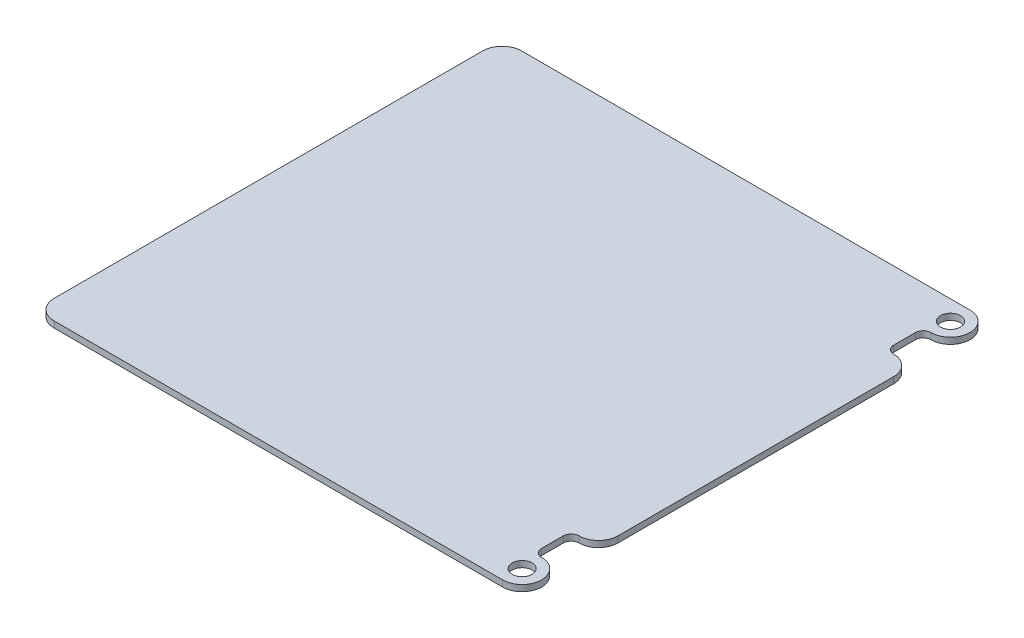
ISO-10303-21;
HEADER;
FILE_DESCRIPTION(('STEP AP214'),'2;1');
FILE_NAME('part.step','',(''),(''),'','','');
FILE_SCHEMA(('AUTOMOTIVE_DESIGN { 1 0 10303 214 1 1 1 1 }'));
ENDSEC;
DATA;
#1=APPLICATION_CONTEXT('core data for automotive mechanical design processes');
#2=APPLICATION_PROTOCOL_DEFINITION('international standard','automotive_design',2000,#1);
#3=PRODUCT_CONTEXT('',#1,'mechanical');
#4=PRODUCT('Part','Part','',(#3));
#5=PRODUCT_RELATED_PRODUCT_CATEGORY('part','',(#4));
#6=PRODUCT_DEFINITION_FORMATION('','',#4);
#7=PRODUCT_DEFINITION_CONTEXT('part definition',#1,'design');
#8=PRODUCT_DEFINITION('design','',#6,#7);
#9=PRODUCT_DEFINITION_SHAPE('','',#8);
#10=(LENGTH_UNIT() NAMED_UNIT(*) SI_UNIT(.MILLI.,.METRE.));
#11=(NAMED_UNIT(*) PLANE_ANGLE_UNIT() SI_UNIT($,.RADIAN.));
#12=(NAMED_UNIT(*) SI_UNIT($,.STERADIAN.) SOLID_ANGLE_UNIT());
#13=UNCERTAINTY_MEASURE_WITH_UNIT(LENGTH_MEASURE(1.E-05),#10,'distance_accuracy_value','');
#14=(GEOMETRIC_REPRESENTATION_CONTEXT(3) GLOBAL_UNCERTAINTY_ASSIGNED_CONTEXT((#13)) GLOBAL_UNIT_ASSIGNED_CONTEXT((#10,
#11,#12)) REPRESENTATION_CONTEXT('',''));
#15=CARTESIAN_POINT('',(0.,0.,0.));
#16=DIRECTION('',(0.,0.,1.));
#17=DIRECTION('',(1.,0.,0.));
#18=AXIS2_PLACEMENT_3D('',#15,#16,#17);
#19=CARTESIAN_POINT('',(-738.366141684511,1.6,633.492700987452));
#20=DIRECTION('',(0.,-1.,0.));
#21=DIRECTION('',(0.,0.,-1.));
#22=AXIS2_PLACEMENT_3D('',#19,#20,#21);
#23=PLANE('',#22);
#24=CARTESIAN_POINT('',(-738.366141684511,1.6,633.492700987452));
#25=DIRECTION('',(0.,1.,0.));
#26=DIRECTION('',(0.,0.,-1.));
#27=AXIS2_PLACEMENT_3D('',#24,#25,#26);
#28=CIRCLE('',#27,5.00000000000004);
#29=CARTESIAN_POINT('',(-743.365717359887,1.6,633.557839809932));
#30=VERTEX_POINT('',#29);
#31=CARTESIAN_POINT('',(-738.301002862009,1.6,638.492276662828));
#32=VERTEX_POINT('',#31);
#33=EDGE_CURVE('E212',#30,#32,#28,.T.);
#34=ORIENTED_EDGE('',*,*,#33,.T.);
#35=DIRECTION('',(1.,0.,0.));
#36=VECTOR('',#35,1.);
#37=CARTESIAN_POINT('',(-738.301002862009,1.6,638.492276662828));
#38=LINE('',#37,#36);
#39=CARTESIAN_POINT('',(-623.30100286201,1.6,638.492276662828));
#40=VERTEX_POINT('',#39);
#41=EDGE_CURVE('E118',#32,#40,#38,.T.);
#42=ORIENTED_EDGE('',*,*,#41,.T.);
#43=CARTESIAN_POINT('',(-623.30100286201,1.6,633.492276662828));
#44=DIRECTION('',(0.,1.,0.));
#45=DIRECTION('',(0.,0.,1.));
#46=AXIS2_PLACEMENT_3D('',#43,#44,#45);
#47=CIRCLE('',#46,4.99999999999995);
#48=CARTESIAN_POINT('',(-623.30100286201,1.6,628.492276662828));
#49=VERTEX_POINT('',#48);
#50=EDGE_CURVE('E250',#40,#49,#47,.T.);
#51=ORIENTED_EDGE('',*,*,#50,.T.);
#52=CARTESIAN_POINT('',(-623.301002862009,1.6,626.492276662828));
#53=DIRECTION('',(0.,-1.,0.));
#54=DIRECTION('',(0.,0.,-1.));
#55=AXIS2_PLACEMENT_3D('',#52,#53,#54);
#56=CIRCLE('',#55,1.99999999999995);
#57=CARTESIAN_POINT('',(-625.301002862009,1.6,626.492276662827));
#58=VERTEX_POINT('',#57);
#59=EDGE_CURVE('E271',#49,#58,#56,.T.);
#60=ORIENTED_EDGE('',*,*,#59,.T.);
#61=DIRECTION('',(0.,0.,-1.));
#62=VECTOR('',#61,1.);
#63=CARTESIAN_POINT('',(-625.301002862009,1.6,626.492276662827));
#64=LINE('',#63,#62);
#65=CARTESIAN_POINT('',(-625.301002862009,1.6,620.922276662827));
#66=VERTEX_POINT('',#65);
#67=EDGE_CURVE('E268',#58,#66,#64,.T.);
#68=ORIENTED_EDGE('',*,*,#67,.T.);
#69=CARTESIAN_POINT('',(-623.301002862009,1.6,620.922276662827));
#70=DIRECTION('',(0.,-1.,0.));
#71=DIRECTION('',(0.,0.,-1.));
#72=AXIS2_PLACEMENT_3D('',#69,#70,#71);
#73=CIRCLE('',#72,1.99999999999995);
#74=CARTESIAN_POINT('',(-623.301002862009,1.6,618.922276662827));
#75=VERTEX_POINT('',#74);
#76=EDGE_CURVE('E270',#66,#75,#73,.T.);
#77=ORIENTED_EDGE('',*,*,#76,.T.);
#78=CARTESIAN_POINT('',(-623.301002862009,1.6,613.922276662828));
#79=DIRECTION('',(0.,1.,0.));
#80=DIRECTION('',(0.,0.,1.));
#81=AXIS2_PLACEMENT_3D('',#78,#79,#80);
#82=CIRCLE('',#81,4.99999999999995);
#83=CARTESIAN_POINT('',(-618.301002862009,1.6,613.922276662828));
#84=VERTEX_POINT('',#83);
#85=EDGE_CURVE('E273',#75,#84,#82,.T.);
#86=ORIENTED_EDGE('',*,*,#85,.T.);
#87=DIRECTION('',(0.,0.,-1.));
#88=VECTOR('',#87,1.);
#89=CARTESIAN_POINT('',(-618.301002862009,1.6,543.193402957037));
#90=LINE('',#89,#88);
#91=CARTESIAN_POINT('',(-618.301002862009,1.6,543.193402957037));
#92=VERTEX_POINT('',#91);
#93=EDGE_CURVE('E279',#84,#92,#90,.T.);
#94=ORIENTED_EDGE('',*,*,#93,.T.);
#95=CARTESIAN_POINT('',(-623.301002862009,1.6,543.193402957037));
#96=DIRECTION('',(0.,1.,0.));
#97=DIRECTION('',(0.,0.,-1.));
#98=AXIS2_PLACEMENT_3D('',#95,#96,#97);
#99=CIRCLE('',#98,4.99999999999995);
#100=CARTESIAN_POINT('',(-623.301002862009,1.6,538.193402957037));
#101=VERTEX_POINT('',#100);
#102=EDGE_CURVE('E281',#92,#101,#99,.T.);
#103=ORIENTED_EDGE('',*,*,#102,.T.);
#104=CARTESIAN_POINT('',(-623.301002862009,1.6,536.193402957038));
#105=DIRECTION('',(0.,-1.,0.));
#106=DIRECTION('',(0.,0.,1.));
#107=AXIS2_PLACEMENT_3D('',#104,#105,#106);
#108=CIRCLE('',#107,1.99999999999995);
#109=CARTESIAN_POINT('',(-625.301002862009,1.6,536.193402957038));
#110=VERTEX_POINT('',#109);
#111=EDGE_CURVE('E283',#101,#110,#108,.T.);
#112=ORIENTED_EDGE('',*,*,#111,.T.);
#113=DIRECTION('',(0.,0.,-1.));
#114=VECTOR('',#113,1.);
#115=CARTESIAN_POINT('',(-625.301002862009,1.6,530.623402957038));
#116=LINE('',#115,#114);
#117=CARTESIAN_POINT('',(-625.301002862009,1.6,530.623402957038));
#118=VERTEX_POINT('',#117);
#119=EDGE_CURVE('E285',#110,#118,#116,.T.);
#120=ORIENTED_EDGE('',*,*,#119,.T.);
#121=CARTESIAN_POINT('',(-623.301002862009,1.6,530.623402957037));
#122=DIRECTION('',(0.,-1.,0.));
#123=DIRECTION('',(0.,0.,1.));
#124=AXIS2_PLACEMENT_3D('',#121,#122,#123);
#125=CIRCLE('',#124,1.99999999999995);
#126=CARTESIAN_POINT('',(-623.30100286201,1.6,528.623402957038));
#127=VERTEX_POINT('',#126);
#128=EDGE_CURVE('E287',#118,#127,#125,.T.);
#129=ORIENTED_EDGE('',*,*,#128,.T.);
#130=CARTESIAN_POINT('',(-623.30100286201,1.6,523.623402957037));
#131=DIRECTION('',(0.,1.,0.));
#132=DIRECTION('',(0.,0.,-1.));
#133=AXIS2_PLACEMENT_3D('',#130,#131,#132);
#134=CIRCLE('',#133,5.00000000000017);
#135=CARTESIAN_POINT('',(-623.30100286201,1.6,518.623402957037));
#136=VERTEX_POINT('',#135);
#137=EDGE_CURVE('E161',#127,#136,#134,.T.);
#138=ORIENTED_EDGE('',*,*,#137,.T.);
#139=DIRECTION('',(-0.999999837667621,0.,-0.000569793587443505));
#140=VECTOR('',#139,1.);
#141=CARTESIAN_POINT('',(-738.365717359887,1.6,518.557839809932));
#142=LINE('',#141,#140);
#143=CARTESIAN_POINT('',(-738.365717359887,1.6,518.557839809932));
#144=VERTEX_POINT('',#143);
#145=EDGE_CURVE('E155',#136,#144,#142,.T.);
#146=ORIENTED_EDGE('',*,*,#145,.T.);
#147=CARTESIAN_POINT('',(-738.365717359887,1.6,523.557839809932));
#148=DIRECTION('',(0.,1.,0.));
#149=DIRECTION('',(0.,0.,1.));
#150=AXIS2_PLACEMENT_3D('',#147,#148,#149);
#151=CIRCLE('',#150,4.99999999999995);
#152=CARTESIAN_POINT('',(-743.365717359887,1.6,523.557839809932));
#153=VERTEX_POINT('',#152);
#154=EDGE_CURVE('E159',#144,#153,#151,.T.);
#155=ORIENTED_EDGE('',*,*,#154,.T.);
#156=DIRECTION('',(0.,0.,1.));
#157=VECTOR('',#156,1.);
#158=CARTESIAN_POINT('',(-743.365717359887,1.6,523.557839809932));
#159=LINE('',#158,#157);
#160=EDGE_CURVE('E51',#153,#30,#159,.T.);
#161=ORIENTED_EDGE('',*,*,#160,.T.);
#162=EDGE_LOOP('',(#34,#42,#51,#60,#68,#77,#86,#94,#103,#112,#120,#129,#138,#146,#155,#161));
#163=FACE_BOUND('',#162,.T.);
#164=CARTESIAN_POINT('',(-623.30100286201,1.6,633.492276662828));
#165=DIRECTION('',(0.,1.,0.));
#166=DIRECTION('',(0.,0.,1.));
#167=AXIS2_PLACEMENT_3D('',#164,#165,#166);
#168=CIRCLE('',#167,2.55000000000004);
#169=CARTESIAN_POINT('',(-623.30100286201,1.6,636.042276662828));
#170=VERTEX_POINT('',#169);
#171=EDGE_CURVE('E183',#170,#170,#168,.T.);
#172=ORIENTED_EDGE('',*,*,#171,.F.);
#173=EDGE_LOOP('',(#172));
#174=FACE_BOUND('',#173,.T.);
#175=CARTESIAN_POINT('',(-623.30100286201,1.6,523.623402957037));
#176=DIRECTION('',(0.,1.,0.));
#177=DIRECTION('',(0.,0.,1.));
#178=AXIS2_PLACEMENT_3D('',#175,#176,#177);
#179=CIRCLE('',#178,2.55000000000004);
#180=CARTESIAN_POINT('',(-623.30100286201,1.6,526.173402957037));
#181=VERTEX_POINT('',#180);
#182=EDGE_CURVE('E499',#181,#181,#179,.T.);
#183=ORIENTED_EDGE('',*,*,#182,.F.);
#184=EDGE_LOOP('',(#183));
#185=FACE_BOUND('',#184,.T.);
#186=ADVANCED_FACE('F34',(#163,#174,#185),#23,.F.);
#187=CARTESIAN_POINT('',(-738.366141684511,0.,633.492700987452));
#188=DIRECTION('',(0.,-1.,0.));
#189=DIRECTION('',(0.,0.,-1.));
#190=AXIS2_PLACEMENT_3D('',#187,#188,#189);
#191=PLANE('',#190);
#192=CARTESIAN_POINT('',(-623.30100286201,0.,633.492276662828));
#193=DIRECTION('',(0.,1.,0.));
#194=DIRECTION('',(0.,0.,1.));
#195=AXIS2_PLACEMENT_3D('',#192,#193,#194);
#196=CIRCLE('',#195,2.55000000000004);
#197=CARTESIAN_POINT('',(-623.30100286201,0.,636.042276662828));
#198=VERTEX_POINT('',#197);
#199=EDGE_CURVE('E496',#198,#198,#196,.T.);
#200=ORIENTED_EDGE('',*,*,#199,.T.);
#201=EDGE_LOOP('',(#200));
#202=FACE_BOUND('',#201,.T.);
#203=CARTESIAN_POINT('',(-738.366141684511,0.,633.492700987452));
#204=DIRECTION('',(0.,1.,0.));
#205=DIRECTION('',(0.,0.,-1.));
#206=AXIS2_PLACEMENT_3D('',#203,#204,#205);
#207=CIRCLE('',#206,5.00000000000004);
#208=CARTESIAN_POINT('',(-743.365717359887,0.,633.557839809932));
#209=VERTEX_POINT('',#208);
#210=CARTESIAN_POINT('',(-738.301002862009,0.,638.492276662828));
#211=VERTEX_POINT('',#210);
#212=EDGE_CURVE('E179',#209,#211,#207,.T.);
#213=ORIENTED_EDGE('',*,*,#212,.F.);
#214=DIRECTION('',(0.,0.,1.));
#215=VECTOR('',#214,1.);
#216=CARTESIAN_POINT('',(-743.365717359887,0.,523.557839809932));
#217=LINE('',#216,#215);
#218=CARTESIAN_POINT('',(-743.365717359887,0.,523.557839809932));
#219=VERTEX_POINT('',#218);
#220=EDGE_CURVE('E110',#219,#209,#217,.T.);
#221=ORIENTED_EDGE('',*,*,#220,.F.);
#222=CARTESIAN_POINT('',(-738.365717359887,0.,523.557839809932));
#223=DIRECTION('',(0.,1.,0.));
#224=DIRECTION('',(0.,0.,1.));
#225=AXIS2_PLACEMENT_3D('',#222,#223,#224);
#226=CIRCLE('',#225,4.99999999999995);
#227=CARTESIAN_POINT('',(-738.365717359887,0.,518.557839809932));
#228=VERTEX_POINT('',#227);
#229=EDGE_CURVE('E104',#228,#219,#226,.T.);
#230=ORIENTED_EDGE('',*,*,#229,.F.);
#231=DIRECTION('',(-0.999999837667621,0.,-0.000569793587443505));
#232=VECTOR('',#231,1.);
#233=CARTESIAN_POINT('',(-738.365717359887,0.,518.557839809932));
#234=LINE('',#233,#232);
#235=CARTESIAN_POINT('',(-623.30100286201,0.,518.623402957037));
#236=VERTEX_POINT('',#235);
#237=EDGE_CURVE('E169',#236,#228,#234,.T.);
#238=ORIENTED_EDGE('',*,*,#237,.F.);
#239=CARTESIAN_POINT('',(-623.30100286201,0.,523.623402957037));
#240=DIRECTION('',(0.,1.,0.));
#241=DIRECTION('',(0.,0.,-1.));
#242=AXIS2_PLACEMENT_3D('',#239,#240,#241);
#243=CIRCLE('',#242,4.99999999999995);
#244=CARTESIAN_POINT('',(-623.30100286201,0.,528.623402957038));
#245=VERTEX_POINT('',#244);
#246=EDGE_CURVE('E207',#245,#236,#243,.T.);
#247=ORIENTED_EDGE('',*,*,#246,.F.);
#248=CARTESIAN_POINT('',(-623.301002862009,0.,530.623402957037));
#249=DIRECTION('',(0.,-1.,0.));
#250=DIRECTION('',(0.,0.,1.));
#251=AXIS2_PLACEMENT_3D('',#248,#249,#250);
#252=CIRCLE('',#251,1.99999999999995);
#253=CARTESIAN_POINT('',(-625.301002862009,0.,530.623402957038));
#254=VERTEX_POINT('',#253);
#255=EDGE_CURVE('E204',#254,#245,#252,.T.);
#256=ORIENTED_EDGE('',*,*,#255,.F.);
#257=DIRECTION('',(0.,0.,-1.));
#258=VECTOR('',#257,1.);
#259=CARTESIAN_POINT('',(-625.301002862009,0.,530.623402957038));
#260=LINE('',#259,#258);
#261=CARTESIAN_POINT('',(-625.301002862009,0.,536.193402957038));
#262=VERTEX_POINT('',#261);
#263=EDGE_CURVE('E202',#262,#254,#260,.T.);
#264=ORIENTED_EDGE('',*,*,#263,.F.);
#265=CARTESIAN_POINT('',(-623.301002862009,0.,536.193402957038));
#266=DIRECTION('',(0.,-1.,0.));
#267=DIRECTION('',(0.,0.,1.));
#268=AXIS2_PLACEMENT_3D('',#265,#266,#267);
#269=CIRCLE('',#268,1.99999999999995);
#270=CARTESIAN_POINT('',(-623.301002862009,0.,538.193402957037));
#271=VERTEX_POINT('',#270);
#272=EDGE_CURVE('E200',#271,#262,#269,.T.);
#273=ORIENTED_EDGE('',*,*,#272,.F.);
#274=CARTESIAN_POINT('',(-623.301002862009,0.,543.193402957037));
#275=DIRECTION('',(0.,1.,0.));
#276=DIRECTION('',(0.,0.,-1.));
#277=AXIS2_PLACEMENT_3D('',#274,#275,#276);
#278=CIRCLE('',#277,4.99999999999995);
#279=CARTESIAN_POINT('',(-618.301002862009,0.,543.193402957037));
#280=VERTEX_POINT('',#279);
#281=EDGE_CURVE('E198',#280,#271,#278,.T.);
#282=ORIENTED_EDGE('',*,*,#281,.F.);
#283=DIRECTION('',(0.,0.,-1.));
#284=VECTOR('',#283,1.);
#285=CARTESIAN_POINT('',(-618.301002862009,0.,543.193402957037));
#286=LINE('',#285,#284);
#287=CARTESIAN_POINT('',(-618.301002862009,0.,613.922276662828));
#288=VERTEX_POINT('',#287);
#289=EDGE_CURVE('E196',#288,#280,#286,.T.);
#290=ORIENTED_EDGE('',*,*,#289,.F.);
#291=CARTESIAN_POINT('',(-623.301002862009,0.,613.922276662828));
#292=DIRECTION('',(0.,1.,0.));
#293=DIRECTION('',(0.,0.,1.));
#294=AXIS2_PLACEMENT_3D('',#291,#292,#293);
#295=CIRCLE('',#294,4.99999999999995);
#296=CARTESIAN_POINT('',(-623.301002862009,0.,618.922276662827));
#297=VERTEX_POINT('',#296);
#298=EDGE_CURVE('E194',#297,#288,#295,.T.);
#299=ORIENTED_EDGE('',*,*,#298,.F.);
#300=CARTESIAN_POINT('',(-623.301002862009,0.,620.922276662827));
#301=DIRECTION('',(0.,-1.,0.));
#302=DIRECTION('',(0.,0.,-1.));
#303=AXIS2_PLACEMENT_3D('',#300,#301,#302);
#304=CIRCLE('',#303,1.99999999999995);
#305=CARTESIAN_POINT('',(-625.301002862009,0.,620.922276662827));
#306=VERTEX_POINT('',#305);
#307=EDGE_CURVE('E192',#306,#297,#304,.T.);
#308=ORIENTED_EDGE('',*,*,#307,.F.);
#309=DIRECTION('',(0.,0.,-1.));
#310=VECTOR('',#309,1.);
#311=CARTESIAN_POINT('',(-625.301002862009,0.,626.492276662827));
#312=LINE('',#311,#310);
#313=CARTESIAN_POINT('',(-625.301002862009,0.,626.492276662827));
#314=VERTEX_POINT('',#313);
#315=EDGE_CURVE('E190',#314,#306,#312,.T.);
#316=ORIENTED_EDGE('',*,*,#315,.F.);
#317=CARTESIAN_POINT('',(-623.301002862009,0.,626.492276662828));
#318=DIRECTION('',(0.,-1.,0.));
#319=DIRECTION('',(0.,0.,-1.));
#320=AXIS2_PLACEMENT_3D('',#317,#318,#319);
#321=CIRCLE('',#320,1.99999999999995);
#322=CARTESIAN_POINT('',(-623.30100286201,0.,628.492276662828));
#323=VERTEX_POINT('',#322);
#324=EDGE_CURVE('E188',#323,#314,#321,.T.);
#325=ORIENTED_EDGE('',*,*,#324,.F.);
#326=CARTESIAN_POINT('',(-623.30100286201,0.,633.492276662828));
#327=DIRECTION('',(0.,1.,0.));
#328=DIRECTION('',(0.,0.,1.));
#329=AXIS2_PLACEMENT_3D('',#326,#327,#328);
#330=CIRCLE('',#329,5.00000000000017);
#331=CARTESIAN_POINT('',(-623.30100286201,0.,638.492276662828));
#332=VERTEX_POINT('',#331);
#333=EDGE_CURVE('E186',#332,#323,#330,.T.);
#334=ORIENTED_EDGE('',*,*,#333,.F.);
#335=DIRECTION('',(1.,0.,0.));
#336=VECTOR('',#335,1.);
#337=CARTESIAN_POINT('',(-738.301002862009,0.,638.492276662828));
#338=LINE('',#337,#336);
#339=EDGE_CURVE('E182',#211,#332,#338,.T.);
#340=ORIENTED_EDGE('',*,*,#339,.F.);
#341=EDGE_LOOP('',(#213,#221,#230,#238,#247,#256,#264,#273,#282,#290,#299,#308,#316,#325,#334,#340));
#342=FACE_BOUND('',#341,.T.);
#343=CARTESIAN_POINT('',(-623.30100286201,0.,523.623402957037));
#344=DIRECTION('',(0.,1.,0.));
#345=DIRECTION('',(0.,0.,1.));
#346=AXIS2_PLACEMENT_3D('',#343,#344,#345);
#347=CIRCLE('',#346,2.55000000000004);
#348=CARTESIAN_POINT('',(-623.30100286201,0.,526.173402957037));
#349=VERTEX_POINT('',#348);
#350=EDGE_CURVE('E502',#349,#349,#347,.T.);
#351=ORIENTED_EDGE('',*,*,#350,.T.);
#352=EDGE_LOOP('',(#351));
#353=FACE_BOUND('',#352,.T.);
#354=ADVANCED_FACE('F255',(#202,#342,#353),#191,.T.);
#355=CARTESIAN_POINT('',(-738.366141684511,1.6,633.492700987452));
#356=DIRECTION('',(0.,-1.,0.));
#357=DIRECTION('',(0.,0.,-1.));
#358=AXIS2_PLACEMENT_3D('',#355,#356,#357);
#359=CYLINDRICAL_SURFACE('',#358,5.00000000000004);
#360=ORIENTED_EDGE('',*,*,#212,.T.);
#361=DIRECTION('',(0.,-1.,0.));
#362=VECTOR('',#361,1.);
#363=CARTESIAN_POINT('',(-738.301002862009,1.6,638.492276662828));
#364=LINE('',#363,#362);
#365=EDGE_CURVE('E11',#32,#211,#364,.T.);
#366=ORIENTED_EDGE('',*,*,#365,.F.);
#367=ORIENTED_EDGE('',*,*,#33,.F.);
#368=DIRECTION('',(0.,-1.,0.));
#369=VECTOR('',#368,1.);
#370=CARTESIAN_POINT('',(-743.365717359887,1.6,633.557839809932));
#371=LINE('',#370,#369);
#372=EDGE_CURVE('E175',#30,#209,#371,.T.);
#373=ORIENTED_EDGE('',*,*,#372,.T.);
#374=EDGE_LOOP('',(#360,#366,#367,#373));
#375=FACE_BOUND('',#374,.T.);
#376=ADVANCED_FACE('F36',(#375),#359,.T.);
#377=CARTESIAN_POINT('',(-738.301002862009,1.6,638.492276662828));
#378=DIRECTION('',(0.,0.,-1.));
#379=DIRECTION('',(-1.,0.,0.));
#380=AXIS2_PLACEMENT_3D('',#377,#378,#379);
#381=PLANE('',#380);
#382=ORIENTED_EDGE('',*,*,#339,.T.);
#383=DIRECTION('',(0.,-1.,0.));
#384=VECTOR('',#383,1.);
#385=CARTESIAN_POINT('',(-623.30100286201,1.6,638.492276662828));
#386=LINE('',#385,#384);
#387=EDGE_CURVE('E43',#40,#332,#386,.T.);
#388=ORIENTED_EDGE('',*,*,#387,.F.);
#389=ORIENTED_EDGE('',*,*,#41,.F.);
#390=ORIENTED_EDGE('',*,*,#365,.T.);
#391=EDGE_LOOP('',(#382,#388,#389,#390));
#392=FACE_BOUND('',#391,.T.);
#393=ADVANCED_FACE('F251',(#392),#381,.F.);
#394=CARTESIAN_POINT('',(-623.30100286201,1.6,633.492276662828));
#395=DIRECTION('',(0.,-1.,0.));
#396=DIRECTION('',(0.,0.,-1.));
#397=AXIS2_PLACEMENT_3D('',#394,#395,#396);
#398=CYLINDRICAL_SURFACE('',#397,5.00000000000017);
#399=ORIENTED_EDGE('',*,*,#333,.T.);
#400=DIRECTION('',(0.,-1.,0.));
#401=VECTOR('',#400,1.);
#402=CARTESIAN_POINT('',(-623.30100286201,1.6,628.492276662828));
#403=LINE('',#402,#401);
#404=EDGE_CURVE('E243',#49,#323,#403,.T.);
#405=ORIENTED_EDGE('',*,*,#404,.F.);
#406=ORIENTED_EDGE('',*,*,#50,.F.);
#407=ORIENTED_EDGE('',*,*,#387,.T.);
#408=EDGE_LOOP('',(#399,#405,#406,#407));
#409=FACE_BOUND('',#408,.T.);
#410=ADVANCED_FACE('F248',(#409),#398,.T.);
#411=CARTESIAN_POINT('',(-623.301002862009,1.6,626.492276662828));
#412=DIRECTION('',(0.,-1.,0.));
#413=DIRECTION('',(0.,0.,-1.));
#414=AXIS2_PLACEMENT_3D('',#411,#412,#413);
#415=CYLINDRICAL_SURFACE('',#414,1.99999999999995);
#416=ORIENTED_EDGE('',*,*,#324,.T.);
#417=DIRECTION('',(0.,-1.,0.));
#418=VECTOR('',#417,1.);
#419=CARTESIAN_POINT('',(-625.301002862009,1.6,626.492276662827));
#420=LINE('',#419,#418);
#421=EDGE_CURVE('E240',#58,#314,#420,.T.);
#422=ORIENTED_EDGE('',*,*,#421,.F.);
#423=ORIENTED_EDGE('',*,*,#59,.F.);
#424=ORIENTED_EDGE('',*,*,#404,.T.);
#425=EDGE_LOOP('',(#416,#422,#423,#424));
#426=FACE_BOUND('',#425,.T.);
#427=ADVANCED_FACE('F262',(#426),#415,.F.);
#428=CARTESIAN_POINT('',(-625.301002862009,1.6,626.492276662827));
#429=DIRECTION('',(-1.,0.,0.));
#430=DIRECTION('',(0.,0.,1.));
#431=AXIS2_PLACEMENT_3D('',#428,#429,#430);
#432=PLANE('',#431);
#433=ORIENTED_EDGE('',*,*,#315,.T.);
#434=DIRECTION('',(0.,-1.,0.));
#435=VECTOR('',#434,1.);
#436=CARTESIAN_POINT('',(-625.301002862009,1.6,620.922276662827));
#437=LINE('',#436,#435);
#438=EDGE_CURVE('E237',#66,#306,#437,.T.);
#439=ORIENTED_EDGE('',*,*,#438,.F.);
#440=ORIENTED_EDGE('',*,*,#67,.F.);
#441=ORIENTED_EDGE('',*,*,#421,.T.);
#442=EDGE_LOOP('',(#433,#439,#440,#441));
#443=FACE_BOUND('',#442,.T.);
#444=ADVANCED_FACE('F266',(#443),#432,.F.);
#445=CARTESIAN_POINT('',(-623.301002862009,1.6,620.922276662827));
#446=DIRECTION('',(0.,-1.,0.));
#447=DIRECTION('',(0.,0.,-1.));
#448=AXIS2_PLACEMENT_3D('',#445,#446,#447);
#449=CYLINDRICAL_SURFACE('',#448,1.99999999999995);
#450=ORIENTED_EDGE('',*,*,#307,.T.);
#451=DIRECTION('',(0.,-1.,0.));
#452=VECTOR('',#451,1.);
#453=CARTESIAN_POINT('',(-623.301002862009,1.6,618.922276662827));
#454=LINE('',#453,#452);
#455=EDGE_CURVE('E234',#75,#297,#454,.T.);
#456=ORIENTED_EDGE('',*,*,#455,.F.);
#457=ORIENTED_EDGE('',*,*,#76,.F.);
#458=ORIENTED_EDGE('',*,*,#438,.T.);
#459=EDGE_LOOP('',(#450,#456,#457,#458));
#460=FACE_BOUND('',#459,.T.);
#461=ADVANCED_FACE('F322',(#460),#449,.F.);
#462=CARTESIAN_POINT('',(-623.301002862009,1.6,613.922276662828));
#463=DIRECTION('',(0.,-1.,0.));
#464=DIRECTION('',(0.,0.,-1.));
#465=AXIS2_PLACEMENT_3D('',#462,#463,#464);
#466=CYLINDRICAL_SURFACE('',#465,4.99999999999995);
#467=ORIENTED_EDGE('',*,*,#298,.T.);
#468=DIRECTION('',(0.,-1.,0.));
#469=VECTOR('',#468,1.);
#470=CARTESIAN_POINT('',(-618.301002862009,1.6,613.922276662828));
#471=LINE('',#470,#469);
#472=EDGE_CURVE('E231',#84,#288,#471,.T.);
#473=ORIENTED_EDGE('',*,*,#472,.F.);
#474=ORIENTED_EDGE('',*,*,#85,.F.);
#475=ORIENTED_EDGE('',*,*,#455,.T.);
#476=EDGE_LOOP('',(#467,#473,#474,#475));
#477=FACE_BOUND('',#476,.T.);
#478=ADVANCED_FACE('F319',(#477),#466,.T.);
#479=CARTESIAN_POINT('',(-618.301002862009,1.6,543.193402957037));
#480=DIRECTION('',(-1.,0.,0.));
#481=DIRECTION('',(0.,0.,1.));
#482=AXIS2_PLACEMENT_3D('',#479,#480,#481);
#483=PLANE('',#482);
#484=ORIENTED_EDGE('',*,*,#289,.T.);
#485=DIRECTION('',(0.,-1.,0.));
#486=VECTOR('',#485,1.);
#487=CARTESIAN_POINT('',(-618.301002862009,1.6,543.193402957037));
#488=LINE('',#487,#486);
#489=EDGE_CURVE('E228',#92,#280,#488,.T.);
#490=ORIENTED_EDGE('',*,*,#489,.F.);
#491=ORIENTED_EDGE('',*,*,#93,.F.);
#492=ORIENTED_EDGE('',*,*,#472,.T.);
#493=EDGE_LOOP('',(#484,#490,#491,#492));
#494=FACE_BOUND('',#493,.T.);
#495=ADVANCED_FACE('F314',(#494),#483,.F.);
#496=CARTESIAN_POINT('',(-623.301002862009,1.6,543.193402957037));
#497=DIRECTION('',(0.,-1.,0.));
#498=DIRECTION('',(0.,0.,-1.));
#499=AXIS2_PLACEMENT_3D('',#496,#497,#498);
#500=CYLINDRICAL_SURFACE('',#499,4.99999999999995);
#501=ORIENTED_EDGE('',*,*,#281,.T.);
#502=DIRECTION('',(0.,-1.,0.));
#503=VECTOR('',#502,1.);
#504=CARTESIAN_POINT('',(-623.301002862009,1.6,538.193402957037));
#505=LINE('',#504,#503);
#506=EDGE_CURVE('E225',#101,#271,#505,.T.);
#507=ORIENTED_EDGE('',*,*,#506,.F.);
#508=ORIENTED_EDGE('',*,*,#102,.F.);
#509=ORIENTED_EDGE('',*,*,#489,.T.);
#510=EDGE_LOOP('',(#501,#507,#508,#509));
#511=FACE_BOUND('',#510,.T.);
#512=ADVANCED_FACE('F309',(#511),#500,.T.);
#513=CARTESIAN_POINT('',(-623.301002862009,1.6,536.193402957038));
#514=DIRECTION('',(0.,-1.,0.));
#515=DIRECTION('',(0.,0.,-1.));
#516=AXIS2_PLACEMENT_3D('',#513,#514,#515);
#517=CYLINDRICAL_SURFACE('',#516,1.99999999999995);
#518=ORIENTED_EDGE('',*,*,#272,.T.);
#519=DIRECTION('',(0.,-1.,0.));
#520=VECTOR('',#519,1.);
#521=CARTESIAN_POINT('',(-625.301002862009,1.6,536.193402957038));
#522=LINE('',#521,#520);
#523=EDGE_CURVE('E222',#110,#262,#522,.T.);
#524=ORIENTED_EDGE('',*,*,#523,.F.);
#525=ORIENTED_EDGE('',*,*,#111,.F.);
#526=ORIENTED_EDGE('',*,*,#506,.T.);
#527=EDGE_LOOP('',(#518,#524,#525,#526));
#528=FACE_BOUND('',#527,.T.);
#529=ADVANCED_FACE('F305',(#528),#517,.F.);
#530=CARTESIAN_POINT('',(-625.301002862009,1.6,530.623402957038));
#531=DIRECTION('',(-1.,0.,0.));
#532=DIRECTION('',(0.,0.,1.));
#533=AXIS2_PLACEMENT_3D('',#530,#531,#532);
#534=PLANE('',#533);
#535=ORIENTED_EDGE('',*,*,#263,.T.);
#536=DIRECTION('',(0.,-1.,0.));
#537=VECTOR('',#536,1.);
#538=CARTESIAN_POINT('',(-625.301002862009,1.6,530.623402957038));
#539=LINE('',#538,#537);
#540=EDGE_CURVE('E219',#118,#254,#539,.T.);
#541=ORIENTED_EDGE('',*,*,#540,.F.);
#542=ORIENTED_EDGE('',*,*,#119,.F.);
#543=ORIENTED_EDGE('',*,*,#523,.T.);
#544=EDGE_LOOP('',(#535,#541,#542,#543));
#545=FACE_BOUND('',#544,.T.);
#546=ADVANCED_FACE('F301',(#545),#534,.F.);
#547=CARTESIAN_POINT('',(-623.301002862009,1.6,530.623402957037));
#548=DIRECTION('',(0.,-1.,0.));
#549=DIRECTION('',(0.,0.,-1.));
#550=AXIS2_PLACEMENT_3D('',#547,#548,#549);
#551=CYLINDRICAL_SURFACE('',#550,1.99999999999995);
#552=ORIENTED_EDGE('',*,*,#255,.T.);
#553=DIRECTION('',(0.,-1.,0.));
#554=VECTOR('',#553,1.);
#555=CARTESIAN_POINT('',(-623.30100286201,1.6,528.623402957038));
#556=LINE('',#555,#554);
#557=EDGE_CURVE('E216',#127,#245,#556,.T.);
#558=ORIENTED_EDGE('',*,*,#557,.F.);
#559=ORIENTED_EDGE('',*,*,#128,.F.);
#560=ORIENTED_EDGE('',*,*,#540,.T.);
#561=EDGE_LOOP('',(#552,#558,#559,#560));
#562=FACE_BOUND('',#561,.T.);
#563=ADVANCED_FACE('F293',(#562),#551,.F.);
#564=CARTESIAN_POINT('',(-623.30100286201,1.6,523.623402957037));
#565=DIRECTION('',(0.,-1.,0.));
#566=DIRECTION('',(0.,0.,-1.));
#567=AXIS2_PLACEMENT_3D('',#564,#565,#566);
#568=CYLINDRICAL_SURFACE('',#567,4.99999999999995);
#569=ORIENTED_EDGE('',*,*,#246,.T.);
#570=DIRECTION('',(0.,-1.,0.));
#571=VECTOR('',#570,1.);
#572=CARTESIAN_POINT('',(-623.30100286201,1.6,518.623402957037));
#573=LINE('',#572,#571);
#574=EDGE_CURVE('E170',#136,#236,#573,.T.);
#575=ORIENTED_EDGE('',*,*,#574,.F.);
#576=ORIENTED_EDGE('',*,*,#137,.F.);
#577=ORIENTED_EDGE('',*,*,#557,.T.);
#578=EDGE_LOOP('',(#569,#575,#576,#577));
#579=FACE_BOUND('',#578,.T.);
#580=ADVANCED_FACE('F296',(#579),#568,.T.);
#581=CARTESIAN_POINT('',(-738.365717359887,1.6,518.557839809932));
#582=DIRECTION('',(-0.000569793587443505,0.,0.999999837667621));
#583=DIRECTION('',(0.999999837667621,0.,0.000569793587443505));
#584=AXIS2_PLACEMENT_3D('',#581,#582,#583);
#585=PLANE('',#584);
#586=ORIENTED_EDGE('',*,*,#237,.T.);
#587=DIRECTION('',(0.,-1.,0.));
#588=VECTOR('',#587,1.);
#589=CARTESIAN_POINT('',(-738.365717359887,1.6,518.557839809932));
#590=LINE('',#589,#588);
#591=EDGE_CURVE('E166',#144,#228,#590,.T.);
#592=ORIENTED_EDGE('',*,*,#591,.F.);
#593=ORIENTED_EDGE('',*,*,#145,.F.);
#594=ORIENTED_EDGE('',*,*,#574,.T.);
#595=EDGE_LOOP('',(#586,#592,#593,#594));
#596=FACE_BOUND('',#595,.T.);
#597=ADVANCED_FACE('F167',(#596),#585,.F.);
#598=CARTESIAN_POINT('',(-738.365717359887,1.6,523.557839809932));
#599=DIRECTION('',(0.,-1.,0.));
#600=DIRECTION('',(0.,0.,-1.));
#601=AXIS2_PLACEMENT_3D('',#598,#599,#600);
#602=CYLINDRICAL_SURFACE('',#601,4.99999999999995);
#603=ORIENTED_EDGE('',*,*,#229,.T.);
#604=DIRECTION('',(0.,-1.,0.));
#605=VECTOR('',#604,1.);
#606=CARTESIAN_POINT('',(-743.365717359887,1.6,523.557839809932));
#607=LINE('',#606,#605);
#608=EDGE_CURVE('E171',#153,#219,#607,.T.);
#609=ORIENTED_EDGE('',*,*,#608,.F.);
#610=ORIENTED_EDGE('',*,*,#154,.F.);
#611=ORIENTED_EDGE('',*,*,#591,.T.);
#612=EDGE_LOOP('',(#603,#609,#610,#611));
#613=FACE_BOUND('',#612,.T.);
#614=ADVANCED_FACE('F173',(#613),#602,.T.);
#615=CARTESIAN_POINT('',(-743.365717359887,1.6,523.557839809932));
#616=DIRECTION('',(1.,0.,0.));
#617=DIRECTION('',(0.,0.,-1.));
#618=AXIS2_PLACEMENT_3D('',#615,#616,#617);
#619=PLANE('',#618);
#620=ORIENTED_EDGE('',*,*,#220,.T.);
#621=ORIENTED_EDGE('',*,*,#372,.F.);
#622=ORIENTED_EDGE('',*,*,#160,.F.);
#623=ORIENTED_EDGE('',*,*,#608,.T.);
#624=EDGE_LOOP('',(#620,#621,#622,#623));
#625=FACE_BOUND('',#624,.T.);
#626=ADVANCED_FACE('F342',(#625),#619,.F.);
#627=CARTESIAN_POINT('',(-623.30100286201,1.6,633.492276662828));
#628=DIRECTION('',(0.,-1.,0.));
#629=DIRECTION('',(0.,0.,-1.));
#630=AXIS2_PLACEMENT_3D('',#627,#628,#629);
#631=CYLINDRICAL_SURFACE('',#630,2.55000000000004);
#632=ORIENTED_EDGE('',*,*,#171,.T.);
#633=EDGE_LOOP('',(#632));
#634=FACE_BOUND('',#633,.T.);
#635=ORIENTED_EDGE('',*,*,#199,.F.);
#636=EDGE_LOOP('',(#635));
#637=FACE_BOUND('',#636,.T.);
#638=ADVANCED_FACE('F339',(#634,#637),#631,.F.);
#639=CARTESIAN_POINT('',(-623.30100286201,1.6,523.623402957037));
#640=DIRECTION('',(0.,-1.,0.));
#641=DIRECTION('',(0.,0.,-1.));
#642=AXIS2_PLACEMENT_3D('',#639,#640,#641);
#643=CYLINDRICAL_SURFACE('',#642,2.55000000000004);
#644=ORIENTED_EDGE('',*,*,#182,.T.);
#645=EDGE_LOOP('',(#644));
#646=FACE_BOUND('',#645,.T.);
#647=ORIENTED_EDGE('',*,*,#350,.F.);
#648=EDGE_LOOP('',(#647));
#649=FACE_BOUND('',#648,.T.);
#650=ADVANCED_FACE('F402',(#646,#649),#643,.F.);
#651=CLOSED_SHELL('',(#186,#354,#376,#393,#410,#427,#444,#461,#478,#495,#512,#529,#546,#563,
#580,#597,#614,#626,#638,#650));
#652=MANIFOLD_SOLID_BREP('B2',#651);
#653=ADVANCED_BREP_SHAPE_REPRESENTATION('',(#18,#652),#14);
#654=SHAPE_DEFINITION_REPRESENTATION(#9,#653);
ENDSEC;
END-ISO-10303-21;
